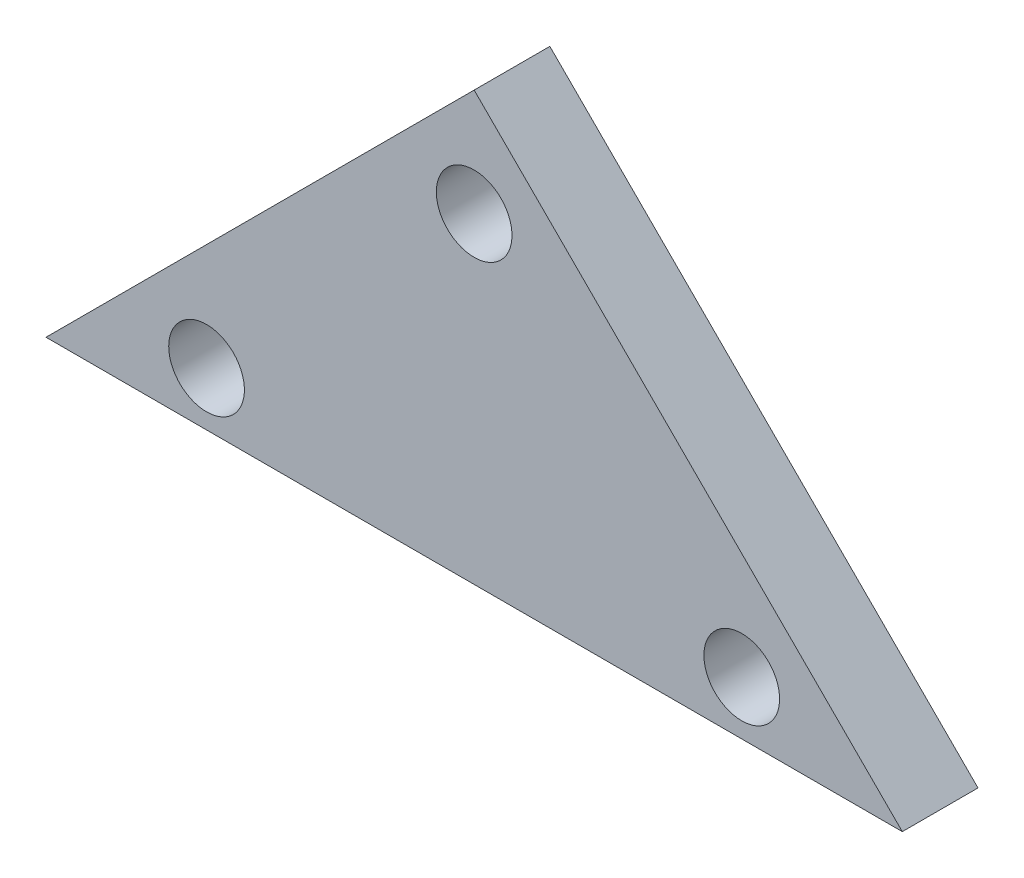
ISO-10303-21;
HEADER;
FILE_DESCRIPTION(('STEP AP214'),'2;1');
FILE_NAME('part.step','',(''),(''),'','','');
FILE_SCHEMA(('AUTOMOTIVE_DESIGN { 1 0 10303 214 1 1 1 1 }'));
ENDSEC;
DATA;
#1=APPLICATION_CONTEXT('core data for automotive mechanical design processes');
#2=APPLICATION_PROTOCOL_DEFINITION('international standard','automotive_design',2000,#1);
#3=PRODUCT_CONTEXT('',#1,'mechanical');
#4=PRODUCT('Part','Part','',(#3));
#5=PRODUCT_RELATED_PRODUCT_CATEGORY('part','',(#4));
#6=PRODUCT_DEFINITION_FORMATION('','',#4);
#7=PRODUCT_DEFINITION_CONTEXT('part definition',#1,'design');
#8=PRODUCT_DEFINITION('design','',#6,#7);
#9=PRODUCT_DEFINITION_SHAPE('','',#8);
#10=(LENGTH_UNIT() NAMED_UNIT(*) SI_UNIT(.MILLI.,.METRE.));
#11=(NAMED_UNIT(*) PLANE_ANGLE_UNIT() SI_UNIT($,.RADIAN.));
#12=(NAMED_UNIT(*) SI_UNIT($,.STERADIAN.) SOLID_ANGLE_UNIT());
#13=UNCERTAINTY_MEASURE_WITH_UNIT(LENGTH_MEASURE(1.E-05),#10,'distance_accuracy_value','');
#14=(GEOMETRIC_REPRESENTATION_CONTEXT(3) GLOBAL_UNCERTAINTY_ASSIGNED_CONTEXT((#13)) GLOBAL_UNIT_ASSIGNED_CONTEXT((#10,
#11,#12)) REPRESENTATION_CONTEXT('',''));
#15=CARTESIAN_POINT('',(0.,0.,0.));
#16=DIRECTION('',(0.,0.,1.));
#17=DIRECTION('',(1.,0.,0.));
#18=AXIS2_PLACEMENT_3D('',#15,#16,#17);
#19=CARTESIAN_POINT('',(0.,0.,4.7625));
#20=DIRECTION('',(0.,0.,-1.));
#21=DIRECTION('',(-1.,0.,0.));
#22=AXIS2_PLACEMENT_3D('',#19,#20,#21);
#23=PLANE('',#22);
#24=DIRECTION('',(-0.707106781186548,-0.707106781186547,0.));
#25=VECTOR('',#24,1.);
#26=CARTESIAN_POINT('',(0.,6.73519209080187,4.7625));
#27=LINE('',#26,#25);
#28=CARTESIAN_POINT('',(0.,6.73519209080187,4.7625));
#29=VERTEX_POINT('',#28);
#30=CARTESIAN_POINT('',(-26.9407683632075,-20.2055762724056,4.7625));
#31=VERTEX_POINT('',#30);
#32=EDGE_CURVE('E74',#29,#31,#27,.T.);
#33=ORIENTED_EDGE('',*,*,#32,.T.);
#34=DIRECTION('',(1.,0.,0.));
#35=VECTOR('',#34,1.);
#36=CARTESIAN_POINT('',(-26.9407683632075,-20.2055762724056,4.7625));
#37=LINE('',#36,#35);
#38=CARTESIAN_POINT('',(26.9407683632075,-20.2055762724056,4.7625));
#39=VERTEX_POINT('',#38);
#40=EDGE_CURVE('E70',#31,#39,#37,.T.);
#41=ORIENTED_EDGE('',*,*,#40,.T.);
#42=DIRECTION('',(-0.707106781186547,0.707106781186548,0.));
#43=VECTOR('',#42,1.);
#44=CARTESIAN_POINT('',(26.9407683632075,-20.2055762724056,4.7625));
#45=LINE('',#44,#43);
#46=EDGE_CURVE('E50',#39,#29,#45,.T.);
#47=ORIENTED_EDGE('',*,*,#46,.T.);
#48=EDGE_LOOP('',(#33,#41,#47));
#49=FACE_BOUND('',#48,.T.);
#50=CARTESIAN_POINT('',(0.,0.,4.7625));
#51=DIRECTION('',(0.,0.,1.));
#52=DIRECTION('',(1.,0.,0.));
#53=AXIS2_PLACEMENT_3D('',#50,#51,#52);
#54=CIRCLE('',#53,2.38125);
#55=CARTESIAN_POINT('',(-2.38125,0.,4.7625));
#56=VERTEX_POINT('',#55);
#57=EDGE_CURVE('E84',#56,#56,#54,.T.);
#58=ORIENTED_EDGE('',*,*,#57,.F.);
#59=EDGE_LOOP('',(#58));
#60=FACE_BOUND('',#59,.T.);
#61=CARTESIAN_POINT('',(16.8379802270047,-16.8379802270047,4.7625));
#62=DIRECTION('',(0.,0.,1.));
#63=DIRECTION('',(1.,0.,0.));
#64=AXIS2_PLACEMENT_3D('',#61,#62,#63);
#65=CIRCLE('',#64,2.38125);
#66=CARTESIAN_POINT('',(14.4567302270047,-16.8379802270047,4.7625));
#67=VERTEX_POINT('',#66);
#68=EDGE_CURVE('E112',#67,#67,#65,.T.);
#69=ORIENTED_EDGE('',*,*,#68,.F.);
#70=EDGE_LOOP('',(#69));
#71=FACE_BOUND('',#70,.T.);
#72=CARTESIAN_POINT('',(-16.8379802270047,-16.8379802270047,4.7625));
#73=DIRECTION('',(0.,0.,1.));
#74=DIRECTION('',(1.,0.,0.));
#75=AXIS2_PLACEMENT_3D('',#72,#73,#74);
#76=CIRCLE('',#75,2.38125);
#77=CARTESIAN_POINT('',(-19.2192302270047,-16.8379802270047,4.7625));
#78=VERTEX_POINT('',#77);
#79=EDGE_CURVE('E106',#78,#78,#76,.T.);
#80=ORIENTED_EDGE('',*,*,#79,.F.);
#81=EDGE_LOOP('',(#80));
#82=FACE_BOUND('',#81,.T.);
#83=ADVANCED_FACE('F33',(#49,#60,#71,#82),#23,.F.);
#84=CARTESIAN_POINT('',(0.,0.,0.));
#85=DIRECTION('',(0.,0.,-1.));
#86=DIRECTION('',(-1.,0.,0.));
#87=AXIS2_PLACEMENT_3D('',#84,#85,#86);
#88=PLANE('',#87);
#89=CARTESIAN_POINT('',(16.8379802270047,-16.8379802270047,0.));
#90=DIRECTION('',(0.,0.,1.));
#91=DIRECTION('',(1.,0.,0.));
#92=AXIS2_PLACEMENT_3D('',#89,#90,#91);
#93=CIRCLE('',#92,2.38125);
#94=CARTESIAN_POINT('',(14.4567302270047,-16.8379802270047,0.));
#95=VERTEX_POINT('',#94);
#96=EDGE_CURVE('E109',#95,#95,#93,.T.);
#97=ORIENTED_EDGE('',*,*,#96,.T.);
#98=EDGE_LOOP('',(#97));
#99=FACE_BOUND('',#98,.T.);
#100=DIRECTION('',(-0.707106781186548,-0.707106781186547,0.));
#101=VECTOR('',#100,1.);
#102=CARTESIAN_POINT('',(0.,6.73519209080187,0.));
#103=LINE('',#102,#101);
#104=CARTESIAN_POINT('',(0.,6.73519209080187,0.));
#105=VERTEX_POINT('',#104);
#106=CARTESIAN_POINT('',(-26.9407683632075,-20.2055762724056,0.));
#107=VERTEX_POINT('',#106);
#108=EDGE_CURVE('E81',#105,#107,#103,.T.);
#109=ORIENTED_EDGE('',*,*,#108,.F.);
#110=DIRECTION('',(-0.707106781186547,0.707106781186548,0.));
#111=VECTOR('',#110,1.);
#112=CARTESIAN_POINT('',(26.9407683632075,-20.2055762724056,0.));
#113=LINE('',#112,#111);
#114=CARTESIAN_POINT('',(26.9407683632075,-20.2055762724056,0.));
#115=VERTEX_POINT('',#114);
#116=EDGE_CURVE('E67',#115,#105,#113,.T.);
#117=ORIENTED_EDGE('',*,*,#116,.F.);
#118=DIRECTION('',(1.,0.,0.));
#119=VECTOR('',#118,1.);
#120=CARTESIAN_POINT('',(-26.9407683632075,-20.2055762724056,0.));
#121=LINE('',#120,#119);
#122=EDGE_CURVE('E62',#107,#115,#121,.T.);
#123=ORIENTED_EDGE('',*,*,#122,.F.);
#124=EDGE_LOOP('',(#109,#117,#123));
#125=FACE_BOUND('',#124,.T.);
#126=CARTESIAN_POINT('',(0.,0.,0.));
#127=DIRECTION('',(0.,0.,1.));
#128=DIRECTION('',(1.,0.,0.));
#129=AXIS2_PLACEMENT_3D('',#126,#127,#128);
#130=CIRCLE('',#129,2.38125);
#131=CARTESIAN_POINT('',(-2.38125,0.,0.));
#132=VERTEX_POINT('',#131);
#133=EDGE_CURVE('E88',#132,#132,#130,.T.);
#134=ORIENTED_EDGE('',*,*,#133,.T.);
#135=EDGE_LOOP('',(#134));
#136=FACE_BOUND('',#135,.T.);
#137=CARTESIAN_POINT('',(-16.8379802270047,-16.8379802270047,0.));
#138=DIRECTION('',(0.,0.,1.));
#139=DIRECTION('',(1.,0.,0.));
#140=AXIS2_PLACEMENT_3D('',#137,#138,#139);
#141=CIRCLE('',#140,2.38125);
#142=CARTESIAN_POINT('',(-19.2192302270047,-16.8379802270047,0.));
#143=VERTEX_POINT('',#142);
#144=EDGE_CURVE('E104',#143,#143,#141,.T.);
#145=ORIENTED_EDGE('',*,*,#144,.T.);
#146=EDGE_LOOP('',(#145));
#147=FACE_BOUND('',#146,.T.);
#148=ADVANCED_FACE('F94',(#99,#125,#136,#147),#88,.T.);
#149=CARTESIAN_POINT('',(0.,6.73519209080187,4.7625));
#150=DIRECTION('',(0.707106781186547,-0.707106781186548,0.));
#151=DIRECTION('',(0.707106781186548,0.707106781186547,0.));
#152=AXIS2_PLACEMENT_3D('',#149,#150,#151);
#153=PLANE('',#152);
#154=ORIENTED_EDGE('',*,*,#108,.T.);
#155=DIRECTION('',(0.,0.,-1.));
#156=VECTOR('',#155,1.);
#157=CARTESIAN_POINT('',(-26.9407683632075,-20.2055762724056,4.7625));
#158=LINE('',#157,#156);
#159=EDGE_CURVE('E11',#31,#107,#158,.T.);
#160=ORIENTED_EDGE('',*,*,#159,.F.);
#161=ORIENTED_EDGE('',*,*,#32,.F.);
#162=DIRECTION('',(0.,0.,-1.));
#163=VECTOR('',#162,1.);
#164=CARTESIAN_POINT('',(0.,6.73519209080187,4.7625));
#165=LINE('',#164,#163);
#166=EDGE_CURVE('E82',#29,#105,#165,.T.);
#167=ORIENTED_EDGE('',*,*,#166,.T.);
#168=EDGE_LOOP('',(#154,#160,#161,#167));
#169=FACE_BOUND('',#168,.T.);
#170=ADVANCED_FACE('F35',(#169),#153,.F.);
#171=CARTESIAN_POINT('',(-26.9407683632075,-20.2055762724056,4.7625));
#172=DIRECTION('',(0.,1.,0.));
#173=DIRECTION('',(-1.,0.,0.));
#174=AXIS2_PLACEMENT_3D('',#171,#172,#173);
#175=PLANE('',#174);
#176=ORIENTED_EDGE('',*,*,#122,.T.);
#177=DIRECTION('',(0.,0.,-1.));
#178=VECTOR('',#177,1.);
#179=CARTESIAN_POINT('',(26.9407683632075,-20.2055762724056,4.7625));
#180=LINE('',#179,#178);
#181=EDGE_CURVE('E42',#39,#115,#180,.T.);
#182=ORIENTED_EDGE('',*,*,#181,.F.);
#183=ORIENTED_EDGE('',*,*,#40,.F.);
#184=ORIENTED_EDGE('',*,*,#159,.T.);
#185=EDGE_LOOP('',(#176,#182,#183,#184));
#186=FACE_BOUND('',#185,.T.);
#187=ADVANCED_FACE('F71',(#186),#175,.F.);
#188=CARTESIAN_POINT('',(26.9407683632075,-20.2055762724056,4.7625));
#189=DIRECTION('',(-0.707106781186548,-0.707106781186547,0.));
#190=DIRECTION('',(0.707106781186547,-0.707106781186548,0.));
#191=AXIS2_PLACEMENT_3D('',#188,#189,#190);
#192=PLANE('',#191);
#193=ORIENTED_EDGE('',*,*,#116,.T.);
#194=ORIENTED_EDGE('',*,*,#166,.F.);
#195=ORIENTED_EDGE('',*,*,#46,.F.);
#196=ORIENTED_EDGE('',*,*,#181,.T.);
#197=EDGE_LOOP('',(#193,#194,#195,#196));
#198=FACE_BOUND('',#197,.T.);
#199=ADVANCED_FACE('F93',(#198),#192,.F.);
#200=CARTESIAN_POINT('',(0.,0.,4.7625));
#201=DIRECTION('',(0.,0.,-1.));
#202=DIRECTION('',(-1.,0.,0.));
#203=AXIS2_PLACEMENT_3D('',#200,#201,#202);
#204=CYLINDRICAL_SURFACE('',#203,2.38125);
#205=CARTESIAN_POINT('',(-2.38125,0.,4.7625));
#206=CARTESIAN_POINT('',(-2.38125,0.,4.712890625));
#207=CARTESIAN_POINT('',(-2.38125,0.,4.66328125));
#208=CARTESIAN_POINT('',(-2.38125,0.,4.5640625));
#209=CARTESIAN_POINT('',(-2.38125,0.,4.514453125));
#210=CARTESIAN_POINT('',(-2.38125,0.,4.415234375));
#211=CARTESIAN_POINT('',(-2.38125,0.,4.365625));
#212=CARTESIAN_POINT('',(-2.38125,0.,4.26640625));
#213=CARTESIAN_POINT('',(-2.38125,0.,4.216796875));
#214=CARTESIAN_POINT('',(-2.38125,0.,4.117578125));
#215=CARTESIAN_POINT('',(-2.38125,0.,4.06796875));
#216=CARTESIAN_POINT('',(-2.38125,0.,3.96875));
#217=CARTESIAN_POINT('',(-2.38125,0.,3.919140625));
#218=CARTESIAN_POINT('',(-2.38125,0.,3.819921875));
#219=CARTESIAN_POINT('',(-2.38125,0.,3.7703125));
#220=CARTESIAN_POINT('',(-2.38125,0.,3.67109375));
#221=CARTESIAN_POINT('',(-2.38125,0.,3.621484375));
#222=CARTESIAN_POINT('',(-2.38125,0.,3.522265625));
#223=CARTESIAN_POINT('',(-2.38125,0.,3.47265625));
#224=CARTESIAN_POINT('',(-2.38125,0.,3.3734375));
#225=CARTESIAN_POINT('',(-2.38125,0.,3.323828125));
#226=CARTESIAN_POINT('',(-2.38125,0.,3.224609375));
#227=CARTESIAN_POINT('',(-2.38125,0.,3.175));
#228=CARTESIAN_POINT('',(-2.38125,0.,3.07578125));
#229=CARTESIAN_POINT('',(-2.38125,0.,3.026171875));
#230=CARTESIAN_POINT('',(-2.38125,0.,2.926953125));
#231=CARTESIAN_POINT('',(-2.38125,0.,2.87734375));
#232=CARTESIAN_POINT('',(-2.38125,0.,2.778125));
#233=CARTESIAN_POINT('',(-2.38125,0.,2.728515625));
#234=CARTESIAN_POINT('',(-2.38125,0.,2.629296875));
#235=CARTESIAN_POINT('',(-2.38125,0.,2.5796875));
#236=CARTESIAN_POINT('',(-2.38125,0.,2.48046875));
#237=CARTESIAN_POINT('',(-2.38125,0.,2.430859375));
#238=CARTESIAN_POINT('',(-2.38125,0.,2.331640625));
#239=CARTESIAN_POINT('',(-2.38125,0.,2.28203125));
#240=CARTESIAN_POINT('',(-2.38125,0.,2.1828125));
#241=CARTESIAN_POINT('',(-2.38125,0.,2.133203125));
#242=CARTESIAN_POINT('',(-2.38125,0.,2.033984375));
#243=CARTESIAN_POINT('',(-2.38125,0.,1.984375));
#244=CARTESIAN_POINT('',(-2.38125,0.,1.88515625));
#245=CARTESIAN_POINT('',(-2.38125,0.,1.835546875));
#246=CARTESIAN_POINT('',(-2.38125,0.,1.736328125));
#247=CARTESIAN_POINT('',(-2.38125,0.,1.68671875));
#248=CARTESIAN_POINT('',(-2.38125,0.,1.5875));
#249=CARTESIAN_POINT('',(-2.38125,0.,1.537890625));
#250=CARTESIAN_POINT('',(-2.38125,0.,1.438671875));
#251=CARTESIAN_POINT('',(-2.38125,0.,1.3890625));
#252=CARTESIAN_POINT('',(-2.38125,0.,1.28984375));
#253=CARTESIAN_POINT('',(-2.38125,0.,1.240234375));
#254=CARTESIAN_POINT('',(-2.38125,0.,1.141015625));
#255=CARTESIAN_POINT('',(-2.38125,0.,1.09140625));
#256=CARTESIAN_POINT('',(-2.38125,0.,0.992187499999999));
#257=CARTESIAN_POINT('',(-2.38125,0.,0.942578124999999));
#258=CARTESIAN_POINT('',(-2.38125,0.,0.843359375));
#259=CARTESIAN_POINT('',(-2.38125,0.,0.79375));
#260=CARTESIAN_POINT('',(-2.38125,0.,0.69453125));
#261=CARTESIAN_POINT('',(-2.38125,0.,0.644921875));
#262=CARTESIAN_POINT('',(-2.38125,0.,0.545703125));
#263=CARTESIAN_POINT('',(-2.38125,0.,0.49609375));
#264=CARTESIAN_POINT('',(-2.38125,0.,0.396875));
#265=CARTESIAN_POINT('',(-2.38125,0.,0.347265625));
#266=CARTESIAN_POINT('',(-2.38125,0.,0.248046875));
#267=CARTESIAN_POINT('',(-2.38125,0.,0.1984375));
#268=CARTESIAN_POINT('',(-2.38125,0.,0.09921875));
#269=CARTESIAN_POINT('',(-2.38125,0.,0.049609375));
#270=CARTESIAN_POINT('',(-2.38125,0.,0.));
#271=B_SPLINE_CURVE_WITH_KNOTS('',3,(#205,#206,#207,#208,#209,#210,#211,#212,#213,#214,#215,
#216,#217,#218,#219,#220,#221,#222,#223,#224,#225,#226,#227,#228,#229,#230,#231,#232,#233,#234,
#235,#236,#237,#238,#239,#240,#241,#242,#243,#244,#245,#246,#247,#248,#249,#250,#251,#252,#253,
#254,#255,#256,#257,#258,#259,#260,#261,#262,#263,#264,#265,#266,#267,#268,#269,#270),
.UNSPECIFIED.,.F.,.F.,(4,2,2,2,2,2,2,2,2,2,2,2,2,2,2,2,2,2,2,2,2,2,2,2,2,2,2,2,2,2,2,2,4),(0.,
0.148828125,0.29765625,0.446484375,0.5953125,0.744140625,0.892968750000001,1.041796875,1.190625,
1.339453125,1.48828125,1.637109375,1.7859375,1.934765625,2.08359375,2.232421875,2.38125,
2.530078125,2.67890625,2.827734375,2.9765625,3.125390625,3.27421875,3.423046875,3.571875,
3.720703125,3.86953125,4.018359375,4.1671875,4.316015625,4.46484375,4.613671875,4.7625),.UNSPECIFIED.);
#272=EDGE_CURVE('BSEAM122',#56,#132,#271,.T.);
#273=ORIENTED_EDGE('',*,*,#57,.T.);
#274=ORIENTED_EDGE('',*,*,#133,.F.);
#275=ORIENTED_EDGE('',*,*,#272,.T.);
#276=ORIENTED_EDGE('',*,*,#272,.F.);
#277=EDGE_LOOP('',(#273,#275,#274,#276));
#278=FACE_BOUND('',#277,.T.);
#279=ADVANCED_FACE('F122',(#278),#204,.F.);
#280=CARTESIAN_POINT('',(16.8379802270047,-16.8379802270047,4.7625));
#281=DIRECTION('',(0.,0.,-1.));
#282=DIRECTION('',(-1.,0.,0.));
#283=AXIS2_PLACEMENT_3D('',#280,#281,#282);
#284=CYLINDRICAL_SURFACE('',#283,2.38125);
#285=CARTESIAN_POINT('',(14.4567302270047,-16.8379802270047,4.7625));
#286=CARTESIAN_POINT('',(14.4567302270047,-16.8379802270047,4.712890625));
#287=CARTESIAN_POINT('',(14.4567302270047,-16.8379802270047,4.66328125));
#288=CARTESIAN_POINT('',(14.4567302270047,-16.8379802270047,4.5640625));
#289=CARTESIAN_POINT('',(14.4567302270047,-16.8379802270047,4.514453125));
#290=CARTESIAN_POINT('',(14.4567302270047,-16.8379802270047,4.415234375));
#291=CARTESIAN_POINT('',(14.4567302270047,-16.8379802270047,4.365625));
#292=CARTESIAN_POINT('',(14.4567302270047,-16.8379802270047,4.26640625));
#293=CARTESIAN_POINT('',(14.4567302270047,-16.8379802270047,4.216796875));
#294=CARTESIAN_POINT('',(14.4567302270047,-16.8379802270047,4.117578125));
#295=CARTESIAN_POINT('',(14.4567302270047,-16.8379802270047,4.06796875));
#296=CARTESIAN_POINT('',(14.4567302270047,-16.8379802270047,3.96875));
#297=CARTESIAN_POINT('',(14.4567302270047,-16.8379802270047,3.919140625));
#298=CARTESIAN_POINT('',(14.4567302270047,-16.8379802270047,3.819921875));
#299=CARTESIAN_POINT('',(14.4567302270047,-16.8379802270047,3.7703125));
#300=CARTESIAN_POINT('',(14.4567302270047,-16.8379802270047,3.67109375));
#301=CARTESIAN_POINT('',(14.4567302270047,-16.8379802270047,3.621484375));
#302=CARTESIAN_POINT('',(14.4567302270047,-16.8379802270047,3.522265625));
#303=CARTESIAN_POINT('',(14.4567302270047,-16.8379802270047,3.47265625));
#304=CARTESIAN_POINT('',(14.4567302270047,-16.8379802270047,3.3734375));
#305=CARTESIAN_POINT('',(14.4567302270047,-16.8379802270047,3.323828125));
#306=CARTESIAN_POINT('',(14.4567302270047,-16.8379802270047,3.224609375));
#307=CARTESIAN_POINT('',(14.4567302270047,-16.8379802270047,3.175));
#308=CARTESIAN_POINT('',(14.4567302270047,-16.8379802270047,3.07578125));
#309=CARTESIAN_POINT('',(14.4567302270047,-16.8379802270047,3.026171875));
#310=CARTESIAN_POINT('',(14.4567302270047,-16.8379802270047,2.926953125));
#311=CARTESIAN_POINT('',(14.4567302270047,-16.8379802270047,2.87734375));
#312=CARTESIAN_POINT('',(14.4567302270047,-16.8379802270047,2.778125));
#313=CARTESIAN_POINT('',(14.4567302270047,-16.8379802270047,2.728515625));
#314=CARTESIAN_POINT('',(14.4567302270047,-16.8379802270047,2.629296875));
#315=CARTESIAN_POINT('',(14.4567302270047,-16.8379802270047,2.5796875));
#316=CARTESIAN_POINT('',(14.4567302270047,-16.8379802270047,2.48046875));
#317=CARTESIAN_POINT('',(14.4567302270047,-16.8379802270047,2.430859375));
#318=CARTESIAN_POINT('',(14.4567302270047,-16.8379802270047,2.331640625));
#319=CARTESIAN_POINT('',(14.4567302270047,-16.8379802270047,2.28203125));
#320=CARTESIAN_POINT('',(14.4567302270047,-16.8379802270047,2.1828125));
#321=CARTESIAN_POINT('',(14.4567302270047,-16.8379802270047,2.133203125));
#322=CARTESIAN_POINT('',(14.4567302270047,-16.8379802270047,2.033984375));
#323=CARTESIAN_POINT('',(14.4567302270047,-16.8379802270047,1.984375));
#324=CARTESIAN_POINT('',(14.4567302270047,-16.8379802270047,1.88515625));
#325=CARTESIAN_POINT('',(14.4567302270047,-16.8379802270047,1.835546875));
#326=CARTESIAN_POINT('',(14.4567302270047,-16.8379802270047,1.736328125));
#327=CARTESIAN_POINT('',(14.4567302270047,-16.8379802270047,1.68671875));
#328=CARTESIAN_POINT('',(14.4567302270047,-16.8379802270047,1.5875));
#329=CARTESIAN_POINT('',(14.4567302270047,-16.8379802270047,1.537890625));
#330=CARTESIAN_POINT('',(14.4567302270047,-16.8379802270047,1.438671875));
#331=CARTESIAN_POINT('',(14.4567302270047,-16.8379802270047,1.3890625));
#332=CARTESIAN_POINT('',(14.4567302270047,-16.8379802270047,1.28984375));
#333=CARTESIAN_POINT('',(14.4567302270047,-16.8379802270047,1.240234375));
#334=CARTESIAN_POINT('',(14.4567302270047,-16.8379802270047,1.141015625));
#335=CARTESIAN_POINT('',(14.4567302270047,-16.8379802270047,1.09140625));
#336=CARTESIAN_POINT('',(14.4567302270047,-16.8379802270047,0.992187499999999));
#337=CARTESIAN_POINT('',(14.4567302270047,-16.8379802270047,0.942578124999999));
#338=CARTESIAN_POINT('',(14.4567302270047,-16.8379802270047,0.843359375));
#339=CARTESIAN_POINT('',(14.4567302270047,-16.8379802270047,0.79375));
#340=CARTESIAN_POINT('',(14.4567302270047,-16.8379802270047,0.69453125));
#341=CARTESIAN_POINT('',(14.4567302270047,-16.8379802270047,0.644921875));
#342=CARTESIAN_POINT('',(14.4567302270047,-16.8379802270047,0.545703125));
#343=CARTESIAN_POINT('',(14.4567302270047,-16.8379802270047,0.49609375));
#344=CARTESIAN_POINT('',(14.4567302270047,-16.8379802270047,0.396875));
#345=CARTESIAN_POINT('',(14.4567302270047,-16.8379802270047,0.347265625));
#346=CARTESIAN_POINT('',(14.4567302270047,-16.8379802270047,0.248046875));
#347=CARTESIAN_POINT('',(14.4567302270047,-16.8379802270047,0.1984375));
#348=CARTESIAN_POINT('',(14.4567302270047,-16.8379802270047,0.09921875));
#349=CARTESIAN_POINT('',(14.4567302270047,-16.8379802270047,0.049609375));
#350=CARTESIAN_POINT('',(14.4567302270047,-16.8379802270047,0.));
#351=B_SPLINE_CURVE_WITH_KNOTS('',3,(#285,#286,#287,#288,#289,#290,#291,#292,#293,#294,#295,
#296,#297,#298,#299,#300,#301,#302,#303,#304,#305,#306,#307,#308,#309,#310,#311,#312,#313,#314,
#315,#316,#317,#318,#319,#320,#321,#322,#323,#324,#325,#326,#327,#328,#329,#330,#331,#332,#333,
#334,#335,#336,#337,#338,#339,#340,#341,#342,#343,#344,#345,#346,#347,#348,#349,#350),
.UNSPECIFIED.,.F.,.F.,(4,2,2,2,2,2,2,2,2,2,2,2,2,2,2,2,2,2,2,2,2,2,2,2,2,2,2,2,2,2,2,2,4),(0.,
0.148828125,0.29765625,0.446484375,0.5953125,0.744140625,0.892968750000001,1.041796875,1.190625,
1.339453125,1.48828125,1.637109375,1.7859375,1.934765625,2.08359375,2.232421875,2.38125,
2.530078125,2.67890625,2.827734375,2.9765625,3.125390625,3.27421875,3.423046875,3.571875,
3.720703125,3.86953125,4.018359375,4.1671875,4.316015625,4.46484375,4.613671875,4.7625),.UNSPECIFIED.);
#352=EDGE_CURVE('BSEAM119',#67,#95,#351,.T.);
#353=ORIENTED_EDGE('',*,*,#68,.T.);
#354=ORIENTED_EDGE('',*,*,#96,.F.);
#355=ORIENTED_EDGE('',*,*,#352,.T.);
#356=ORIENTED_EDGE('',*,*,#352,.F.);
#357=EDGE_LOOP('',(#353,#355,#354,#356));
#358=FACE_BOUND('',#357,.T.);
#359=ADVANCED_FACE('F119',(#358),#284,.F.);
#360=CARTESIAN_POINT('',(-16.8379802270047,-16.8379802270047,4.7625));
#361=DIRECTION('',(0.,0.,-1.));
#362=DIRECTION('',(-1.,0.,0.));
#363=AXIS2_PLACEMENT_3D('',#360,#361,#362);
#364=CYLINDRICAL_SURFACE('',#363,2.38125);
#365=CARTESIAN_POINT('',(-19.2192302270047,-16.8379802270047,4.7625));
#366=CARTESIAN_POINT('',(-19.2192302270047,-16.8379802270047,4.712890625));
#367=CARTESIAN_POINT('',(-19.2192302270047,-16.8379802270047,4.66328125));
#368=CARTESIAN_POINT('',(-19.2192302270047,-16.8379802270047,4.5640625));
#369=CARTESIAN_POINT('',(-19.2192302270047,-16.8379802270047,4.514453125));
#370=CARTESIAN_POINT('',(-19.2192302270047,-16.8379802270047,4.415234375));
#371=CARTESIAN_POINT('',(-19.2192302270047,-16.8379802270047,4.365625));
#372=CARTESIAN_POINT('',(-19.2192302270047,-16.8379802270047,4.26640625));
#373=CARTESIAN_POINT('',(-19.2192302270047,-16.8379802270047,4.216796875));
#374=CARTESIAN_POINT('',(-19.2192302270047,-16.8379802270047,4.117578125));
#375=CARTESIAN_POINT('',(-19.2192302270047,-16.8379802270047,4.06796875));
#376=CARTESIAN_POINT('',(-19.2192302270047,-16.8379802270047,3.96875));
#377=CARTESIAN_POINT('',(-19.2192302270047,-16.8379802270047,3.919140625));
#378=CARTESIAN_POINT('',(-19.2192302270047,-16.8379802270047,3.819921875));
#379=CARTESIAN_POINT('',(-19.2192302270047,-16.8379802270047,3.7703125));
#380=CARTESIAN_POINT('',(-19.2192302270047,-16.8379802270047,3.67109375));
#381=CARTESIAN_POINT('',(-19.2192302270047,-16.8379802270047,3.621484375));
#382=CARTESIAN_POINT('',(-19.2192302270047,-16.8379802270047,3.522265625));
#383=CARTESIAN_POINT('',(-19.2192302270047,-16.8379802270047,3.47265625));
#384=CARTESIAN_POINT('',(-19.2192302270047,-16.8379802270047,3.3734375));
#385=CARTESIAN_POINT('',(-19.2192302270047,-16.8379802270047,3.323828125));
#386=CARTESIAN_POINT('',(-19.2192302270047,-16.8379802270047,3.224609375));
#387=CARTESIAN_POINT('',(-19.2192302270047,-16.8379802270047,3.175));
#388=CARTESIAN_POINT('',(-19.2192302270047,-16.8379802270047,3.07578125));
#389=CARTESIAN_POINT('',(-19.2192302270047,-16.8379802270047,3.026171875));
#390=CARTESIAN_POINT('',(-19.2192302270047,-16.8379802270047,2.926953125));
#391=CARTESIAN_POINT('',(-19.2192302270047,-16.8379802270047,2.87734375));
#392=CARTESIAN_POINT('',(-19.2192302270047,-16.8379802270047,2.778125));
#393=CARTESIAN_POINT('',(-19.2192302270047,-16.8379802270047,2.728515625));
#394=CARTESIAN_POINT('',(-19.2192302270047,-16.8379802270047,2.629296875));
#395=CARTESIAN_POINT('',(-19.2192302270047,-16.8379802270047,2.5796875));
#396=CARTESIAN_POINT('',(-19.2192302270047,-16.8379802270047,2.48046875));
#397=CARTESIAN_POINT('',(-19.2192302270047,-16.8379802270047,2.430859375));
#398=CARTESIAN_POINT('',(-19.2192302270047,-16.8379802270047,2.331640625));
#399=CARTESIAN_POINT('',(-19.2192302270047,-16.8379802270047,2.28203125));
#400=CARTESIAN_POINT('',(-19.2192302270047,-16.8379802270047,2.1828125));
#401=CARTESIAN_POINT('',(-19.2192302270047,-16.8379802270047,2.133203125));
#402=CARTESIAN_POINT('',(-19.2192302270047,-16.8379802270047,2.033984375));
#403=CARTESIAN_POINT('',(-19.2192302270047,-16.8379802270047,1.984375));
#404=CARTESIAN_POINT('',(-19.2192302270047,-16.8379802270047,1.88515625));
#405=CARTESIAN_POINT('',(-19.2192302270047,-16.8379802270047,1.835546875));
#406=CARTESIAN_POINT('',(-19.2192302270047,-16.8379802270047,1.736328125));
#407=CARTESIAN_POINT('',(-19.2192302270047,-16.8379802270047,1.68671875));
#408=CARTESIAN_POINT('',(-19.2192302270047,-16.8379802270047,1.5875));
#409=CARTESIAN_POINT('',(-19.2192302270047,-16.8379802270047,1.537890625));
#410=CARTESIAN_POINT('',(-19.2192302270047,-16.8379802270047,1.438671875));
#411=CARTESIAN_POINT('',(-19.2192302270047,-16.8379802270047,1.3890625));
#412=CARTESIAN_POINT('',(-19.2192302270047,-16.8379802270047,1.28984375));
#413=CARTESIAN_POINT('',(-19.2192302270047,-16.8379802270047,1.240234375));
#414=CARTESIAN_POINT('',(-19.2192302270047,-16.8379802270047,1.141015625));
#415=CARTESIAN_POINT('',(-19.2192302270047,-16.8379802270047,1.09140625));
#416=CARTESIAN_POINT('',(-19.2192302270047,-16.8379802270047,0.992187499999999));
#417=CARTESIAN_POINT('',(-19.2192302270047,-16.8379802270047,0.942578124999999));
#418=CARTESIAN_POINT('',(-19.2192302270047,-16.8379802270047,0.843359375));
#419=CARTESIAN_POINT('',(-19.2192302270047,-16.8379802270047,0.79375));
#420=CARTESIAN_POINT('',(-19.2192302270047,-16.8379802270047,0.69453125));
#421=CARTESIAN_POINT('',(-19.2192302270047,-16.8379802270047,0.644921875));
#422=CARTESIAN_POINT('',(-19.2192302270047,-16.8379802270047,0.545703125));
#423=CARTESIAN_POINT('',(-19.2192302270047,-16.8379802270047,0.49609375));
#424=CARTESIAN_POINT('',(-19.2192302270047,-16.8379802270047,0.396875));
#425=CARTESIAN_POINT('',(-19.2192302270047,-16.8379802270047,0.347265625));
#426=CARTESIAN_POINT('',(-19.2192302270047,-16.8379802270047,0.248046875));
#427=CARTESIAN_POINT('',(-19.2192302270047,-16.8379802270047,0.1984375));
#428=CARTESIAN_POINT('',(-19.2192302270047,-16.8379802270047,0.09921875));
#429=CARTESIAN_POINT('',(-19.2192302270047,-16.8379802270047,0.049609375));
#430=CARTESIAN_POINT('',(-19.2192302270047,-16.8379802270047,0.));
#431=B_SPLINE_CURVE_WITH_KNOTS('',3,(#365,#366,#367,#368,#369,#370,#371,#372,#373,#374,#375,
#376,#377,#378,#379,#380,#381,#382,#383,#384,#385,#386,#387,#388,#389,#390,#391,#392,#393,#394,
#395,#396,#397,#398,#399,#400,#401,#402,#403,#404,#405,#406,#407,#408,#409,#410,#411,#412,#413,
#414,#415,#416,#417,#418,#419,#420,#421,#422,#423,#424,#425,#426,#427,#428,#429,#430),
.UNSPECIFIED.,.F.,.F.,(4,2,2,2,2,2,2,2,2,2,2,2,2,2,2,2,2,2,2,2,2,2,2,2,2,2,2,2,2,2,2,2,4),(0.,
0.148828125,0.29765625,0.446484375,0.5953125,0.744140625,0.892968750000001,1.041796875,1.190625,
1.339453125,1.48828125,1.637109375,1.7859375,1.934765625,2.08359375,2.232421875,2.38125,
2.530078125,2.67890625,2.827734375,2.9765625,3.125390625,3.27421875,3.423046875,3.571875,
3.720703125,3.86953125,4.018359375,4.1671875,4.316015625,4.46484375,4.613671875,4.7625),.UNSPECIFIED.);
#432=EDGE_CURVE('BSEAM121',#78,#143,#431,.T.);
#433=ORIENTED_EDGE('',*,*,#79,.T.);
#434=ORIENTED_EDGE('',*,*,#144,.F.);
#435=ORIENTED_EDGE('',*,*,#432,.T.);
#436=ORIENTED_EDGE('',*,*,#432,.F.);
#437=EDGE_LOOP('',(#433,#435,#434,#436));
#438=FACE_BOUND('',#437,.T.);
#439=ADVANCED_FACE('F121',(#438),#364,.F.);
#440=CLOSED_SHELL('',(#83,#148,#170,#187,#199,#279,#359,#439));
#441=MANIFOLD_SOLID_BREP('B2',#440);
#442=ADVANCED_BREP_SHAPE_REPRESENTATION('',(#18,#441),#14);
#443=SHAPE_DEFINITION_REPRESENTATION(#9,#442);
ENDSEC;
END-ISO-10303-21;
